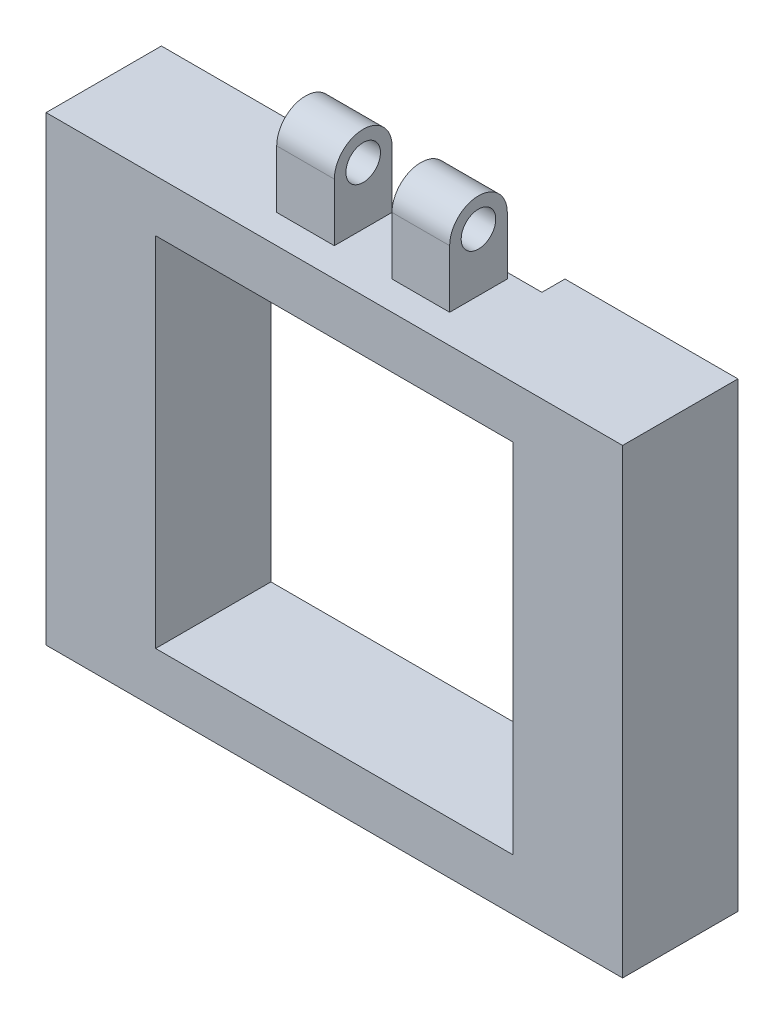
ISO-10303-21;
HEADER;
FILE_DESCRIPTION(('STEP AP214'),'2;1');
FILE_NAME('part.step','',(''),(''),'','','');
FILE_SCHEMA(('AUTOMOTIVE_DESIGN { 1 0 10303 214 1 1 1 1 }'));
ENDSEC;
DATA;
#1=APPLICATION_CONTEXT('core data for automotive mechanical design processes');
#2=APPLICATION_PROTOCOL_DEFINITION('international standard','automotive_design',2000,#1);
#3=PRODUCT_CONTEXT('',#1,'mechanical');
#4=PRODUCT('Part','Part','',(#3));
#5=PRODUCT_RELATED_PRODUCT_CATEGORY('part','',(#4));
#6=PRODUCT_DEFINITION_FORMATION('','',#4);
#7=PRODUCT_DEFINITION_CONTEXT('part definition',#1,'design');
#8=PRODUCT_DEFINITION('design','',#6,#7);
#9=PRODUCT_DEFINITION_SHAPE('','',#8);
#10=(LENGTH_UNIT() NAMED_UNIT(*) SI_UNIT(.MILLI.,.METRE.));
#11=(NAMED_UNIT(*) PLANE_ANGLE_UNIT() SI_UNIT($,.RADIAN.));
#12=(NAMED_UNIT(*) SI_UNIT($,.STERADIAN.) SOLID_ANGLE_UNIT());
#13=UNCERTAINTY_MEASURE_WITH_UNIT(LENGTH_MEASURE(1.E-05),#10,'distance_accuracy_value','');
#14=(GEOMETRIC_REPRESENTATION_CONTEXT(3) GLOBAL_UNCERTAINTY_ASSIGNED_CONTEXT((#13)) GLOBAL_UNIT_ASSIGNED_CONTEXT((#10,
#11,#12)) REPRESENTATION_CONTEXT('',''));
#15=CARTESIAN_POINT('',(0.,0.,0.));
#16=DIRECTION('',(0.,0.,1.));
#17=DIRECTION('',(1.,0.,0.));
#18=AXIS2_PLACEMENT_3D('',#15,#16,#17);
#19=CARTESIAN_POINT('',(-3.96850295792851,467.637931034483,7.5));
#20=DIRECTION('',(0.,0.,-1.));
#21=DIRECTION('',(-1.,0.,0.));
#22=AXIS2_PLACEMENT_3D('',#19,#20,#21);
#23=PLANE('',#22);
#24=DIRECTION('',(1.,0.,0.));
#25=VECTOR('',#24,1.);
#26=CARTESIAN_POINT('',(-13.9685029579222,462.637931034483,7.5));
#27=LINE('',#26,#25);
#28=CARTESIAN_POINT('',(-8.96850295792851,462.637931034483,7.5));
#29=VERTEX_POINT('',#28);
#30=CARTESIAN_POINT('',(-3.96850295792851,462.637931034483,7.5));
#31=VERTEX_POINT('',#30);
#32=EDGE_CURVE('E248',#29,#31,#27,.T.);
#33=ORIENTED_EDGE('',*,*,#32,.F.);
#34=DIRECTION('',(0.,-1.,0.));
#35=VECTOR('',#34,1.);
#36=CARTESIAN_POINT('',(-8.96850295792851,467.637931034483,7.5));
#37=LINE('',#36,#35);
#38=CARTESIAN_POINT('',(-8.96850295792851,457.637931034483,7.5));
#39=VERTEX_POINT('',#38);
#40=EDGE_CURVE('E313',#29,#39,#37,.T.);
#41=ORIENTED_EDGE('',*,*,#40,.T.);
#42=DIRECTION('',(1.,0.,0.));
#43=VECTOR('',#42,1.);
#44=CARTESIAN_POINT('',(-3.96850295792851,457.637931034483,7.5));
#45=LINE('',#44,#43);
#46=CARTESIAN_POINT('',(-3.96850295792851,457.637931034483,7.5));
#47=VERTEX_POINT('',#46);
#48=EDGE_CURVE('E317',#39,#47,#45,.T.);
#49=ORIENTED_EDGE('',*,*,#48,.T.);
#50=DIRECTION('',(0.,1.,0.));
#51=VECTOR('',#50,1.);
#52=CARTESIAN_POINT('',(-3.96850295792851,457.637931034483,7.5));
#53=LINE('',#52,#51);
#54=EDGE_CURVE('E280',#47,#31,#53,.T.);
#55=ORIENTED_EDGE('',*,*,#54,.T.);
#56=EDGE_LOOP('',(#33,#41,#49,#55));
#57=FACE_BOUND('',#56,.T.);
#58=ADVANCED_FACE('F40',(#57),#23,.F.);
#59=CARTESIAN_POINT('',(1.0314970420778,462.637931034483,7.5));
#60=VERTEX_POINT('',#59);
#61=CARTESIAN_POINT('',(6.0314970420778,462.637931034483,7.5));
#62=VERTEX_POINT('',#61);
#63=EDGE_CURVE('E245',#60,#62,#27,.T.);
#64=ORIENTED_EDGE('',*,*,#63,.F.);
#65=DIRECTION('',(0.,1.,0.));
#66=VECTOR('',#65,1.);
#67=CARTESIAN_POINT('',(1.0314970420778,457.637931034483,7.5));
#68=LINE('',#67,#66);
#69=CARTESIAN_POINT('',(1.0314970420778,457.637931034483,7.5));
#70=VERTEX_POINT('',#69);
#71=EDGE_CURVE('E290',#70,#60,#68,.T.);
#72=ORIENTED_EDGE('',*,*,#71,.F.);
#73=CARTESIAN_POINT('',(6.0314970420778,457.637931034483,7.5));
#74=VERTEX_POINT('',#73);
#75=EDGE_CURVE('E316',#70,#74,#45,.T.);
#76=ORIENTED_EDGE('',*,*,#75,.T.);
#77=DIRECTION('',(0.,-1.,0.));
#78=VECTOR('',#77,1.);
#79=CARTESIAN_POINT('',(6.0314970420778,467.637931034483,7.5));
#80=LINE('',#79,#78);
#81=EDGE_CURVE('E300',#62,#74,#80,.T.);
#82=ORIENTED_EDGE('',*,*,#81,.F.);
#83=EDGE_LOOP('',(#64,#72,#76,#82));
#84=FACE_BOUND('',#83,.T.);
#85=ADVANCED_FACE('F443',(#84),#23,.F.);
#86=CARTESIAN_POINT('',(-8.96850295792851,467.637931034483,7.5));
#87=DIRECTION('',(1.,0.,0.));
#88=DIRECTION('',(0.,0.,-1.));
#89=AXIS2_PLACEMENT_3D('',#86,#87,#88);
#90=PLANE('',#89);
#91=CARTESIAN_POINT('',(-8.96850295792851,462.637931034483,5.));
#92=DIRECTION('',(-1.,0.,0.));
#93=DIRECTION('',(0.,0.,1.));
#94=AXIS2_PLACEMENT_3D('',#91,#92,#93);
#95=CIRCLE('',#94,1.5);
#96=CARTESIAN_POINT('',(-8.96850295792851,462.637931034483,6.5));
#97=VERTEX_POINT('',#96);
#98=EDGE_CURVE('E259',#97,#97,#95,.T.);
#99=ORIENTED_EDGE('',*,*,#98,.F.);
#100=EDGE_LOOP('',(#99));
#101=FACE_BOUND('',#100,.T.);
#102=CARTESIAN_POINT('',(-8.96850295792851,462.637931034483,5.));
#103=DIRECTION('',(1.,0.,0.));
#104=DIRECTION('',(0.,0.,-1.));
#105=AXIS2_PLACEMENT_3D('',#102,#103,#104);
#106=CIRCLE('',#105,2.5);
#107=CARTESIAN_POINT('',(-8.96850295792851,462.637931034483,2.5));
#108=VERTEX_POINT('',#107);
#109=EDGE_CURVE('E256',#108,#29,#106,.T.);
#110=ORIENTED_EDGE('',*,*,#109,.F.);
#111=DIRECTION('',(0.,-1.,0.));
#112=VECTOR('',#111,1.);
#113=CARTESIAN_POINT('',(-8.96850295792851,467.637931034483,2.5));
#114=LINE('',#113,#112);
#115=CARTESIAN_POINT('',(-8.96850295792851,457.637931034483,2.5));
#116=VERTEX_POINT('',#115);
#117=EDGE_CURVE('E310',#108,#116,#114,.T.);
#118=ORIENTED_EDGE('',*,*,#117,.T.);
#119=DIRECTION('',(0.,0.,1.));
#120=VECTOR('',#119,1.);
#121=CARTESIAN_POINT('',(-8.96850295792851,457.637931034483,7.5));
#122=LINE('',#121,#120);
#123=EDGE_CURVE('E306',#116,#39,#122,.T.);
#124=ORIENTED_EDGE('',*,*,#123,.T.);
#125=ORIENTED_EDGE('',*,*,#40,.F.);
#126=EDGE_LOOP('',(#110,#118,#124,#125));
#127=FACE_BOUND('',#126,.T.);
#128=ADVANCED_FACE('F428',(#101,#127),#90,.F.);
#129=CARTESIAN_POINT('',(6.0314970420778,467.637931034483,7.5));
#130=DIRECTION('',(-1.,0.,0.));
#131=DIRECTION('',(0.,0.,1.));
#132=AXIS2_PLACEMENT_3D('',#129,#130,#131);
#133=PLANE('',#132);
#134=CARTESIAN_POINT('',(6.0314970420778,462.637931034483,5.));
#135=DIRECTION('',(-1.,0.,0.));
#136=DIRECTION('',(0.,0.,1.));
#137=AXIS2_PLACEMENT_3D('',#134,#135,#136);
#138=CIRCLE('',#137,1.5);
#139=CARTESIAN_POINT('',(6.0314970420778,462.637931034483,6.5));
#140=VERTEX_POINT('',#139);
#141=EDGE_CURVE('E268',#140,#140,#138,.T.);
#142=ORIENTED_EDGE('',*,*,#141,.T.);
#143=EDGE_LOOP('',(#142));
#144=FACE_BOUND('',#143,.T.);
#145=CARTESIAN_POINT('',(6.0314970420778,462.637931034483,5.));
#146=DIRECTION('',(1.,0.,0.));
#147=DIRECTION('',(0.,0.,-1.));
#148=AXIS2_PLACEMENT_3D('',#145,#146,#147);
#149=CIRCLE('',#148,2.5);
#150=CARTESIAN_POINT('',(6.0314970420778,462.637931034483,2.5));
#151=VERTEX_POINT('',#150);
#152=EDGE_CURVE('E232',#151,#62,#149,.T.);
#153=ORIENTED_EDGE('',*,*,#152,.T.);
#154=ORIENTED_EDGE('',*,*,#81,.T.);
#155=DIRECTION('',(0.,0.,-1.));
#156=VECTOR('',#155,1.);
#157=CARTESIAN_POINT('',(6.0314970420778,457.637931034483,7.5));
#158=LINE('',#157,#156);
#159=CARTESIAN_POINT('',(6.0314970420778,457.637931034483,2.5));
#160=VERTEX_POINT('',#159);
#161=EDGE_CURVE('E285',#74,#160,#158,.T.);
#162=ORIENTED_EDGE('',*,*,#161,.T.);
#163=DIRECTION('',(0.,-1.,0.));
#164=VECTOR('',#163,1.);
#165=CARTESIAN_POINT('',(6.0314970420778,467.637931034483,2.5));
#166=LINE('',#165,#164);
#167=EDGE_CURVE('E303',#151,#160,#166,.T.);
#168=ORIENTED_EDGE('',*,*,#167,.F.);
#169=EDGE_LOOP('',(#153,#154,#162,#168));
#170=FACE_BOUND('',#169,.T.);
#171=ADVANCED_FACE('F615',(#144,#170),#133,.F.);
#172=CARTESIAN_POINT('',(-3.96850295792851,467.637931034483,7.5));
#173=DIRECTION('',(-1.,0.,0.));
#174=DIRECTION('',(0.,0.,1.));
#175=AXIS2_PLACEMENT_3D('',#172,#173,#174);
#176=PLANE('',#175);
#177=CARTESIAN_POINT('',(-3.96850295792851,462.637931034483,5.));
#178=DIRECTION('',(-1.,0.,0.));
#179=DIRECTION('',(0.,0.,1.));
#180=AXIS2_PLACEMENT_3D('',#177,#178,#179);
#181=CIRCLE('',#180,1.5);
#182=CARTESIAN_POINT('',(-3.96850295792851,462.637931034483,6.5));
#183=VERTEX_POINT('',#182);
#184=EDGE_CURVE('E264',#183,#183,#181,.T.);
#185=ORIENTED_EDGE('',*,*,#184,.T.);
#186=EDGE_LOOP('',(#185));
#187=FACE_BOUND('',#186,.T.);
#188=CARTESIAN_POINT('',(-3.96850295792851,462.637931034483,5.));
#189=DIRECTION('',(-1.,0.,0.));
#190=DIRECTION('',(0.,0.,1.));
#191=AXIS2_PLACEMENT_3D('',#188,#189,#190);
#192=CIRCLE('',#191,2.5);
#193=CARTESIAN_POINT('',(-3.96850295792851,462.637931034483,2.5));
#194=VERTEX_POINT('',#193);
#195=EDGE_CURVE('E253',#31,#194,#192,.T.);
#196=ORIENTED_EDGE('',*,*,#195,.F.);
#197=ORIENTED_EDGE('',*,*,#54,.F.);
#198=DIRECTION('',(0.,0.,1.));
#199=VECTOR('',#198,1.);
#200=CARTESIAN_POINT('',(-3.96850295792851,457.637931034483,2.5));
#201=LINE('',#200,#199);
#202=CARTESIAN_POINT('',(-3.96850295792851,457.637931034483,2.5));
#203=VERTEX_POINT('',#202);
#204=EDGE_CURVE('E272',#203,#47,#201,.T.);
#205=ORIENTED_EDGE('',*,*,#204,.F.);
#206=DIRECTION('',(0.,1.,0.));
#207=VECTOR('',#206,1.);
#208=CARTESIAN_POINT('',(-3.96850295792851,457.637931034483,2.5));
#209=LINE('',#208,#207);
#210=EDGE_CURVE('E281',#203,#194,#209,.T.);
#211=ORIENTED_EDGE('',*,*,#210,.T.);
#212=EDGE_LOOP('',(#196,#197,#205,#211));
#213=FACE_BOUND('',#212,.T.);
#214=ADVANCED_FACE('F420',(#187,#213),#176,.F.);
#215=CARTESIAN_POINT('',(1.0314970420778,467.637931034483,7.5));
#216=DIRECTION('',(1.,0.,0.));
#217=DIRECTION('',(0.,0.,-1.));
#218=AXIS2_PLACEMENT_3D('',#215,#216,#217);
#219=PLANE('',#218);
#220=CARTESIAN_POINT('',(1.0314970420778,462.637931034483,5.));
#221=DIRECTION('',(1.,0.,0.));
#222=DIRECTION('',(0.,0.,-1.));
#223=AXIS2_PLACEMENT_3D('',#220,#221,#222);
#224=CIRCLE('',#223,1.5);
#225=CARTESIAN_POINT('',(1.0314970420778,462.637931034483,3.5));
#226=VERTEX_POINT('',#225);
#227=EDGE_CURVE('E263',#226,#226,#224,.T.);
#228=ORIENTED_EDGE('',*,*,#227,.T.);
#229=EDGE_LOOP('',(#228));
#230=FACE_BOUND('',#229,.T.);
#231=CARTESIAN_POINT('',(1.0314970420778,462.637931034483,5.));
#232=DIRECTION('',(1.,0.,0.));
#233=DIRECTION('',(0.,0.,-1.));
#234=AXIS2_PLACEMENT_3D('',#231,#232,#233);
#235=CIRCLE('',#234,2.5);
#236=CARTESIAN_POINT('',(1.03149704207149,462.637931034483,2.5));
#237=VERTEX_POINT('',#236);
#238=EDGE_CURVE('E369',#237,#60,#235,.T.);
#239=ORIENTED_EDGE('',*,*,#238,.F.);
#240=DIRECTION('',(0.,1.,0.));
#241=VECTOR('',#240,1.);
#242=CARTESIAN_POINT('',(1.03149704207149,457.637931034483,2.5));
#243=LINE('',#242,#241);
#244=CARTESIAN_POINT('',(1.03149704207149,457.637931034483,2.5));
#245=VERTEX_POINT('',#244);
#246=EDGE_CURVE('E286',#245,#237,#243,.T.);
#247=ORIENTED_EDGE('',*,*,#246,.F.);
#248=DIRECTION('',(-1.26114396703514E-12,0.,-1.));
#249=VECTOR('',#248,1.);
#250=CARTESIAN_POINT('',(1.03149704207149,457.637931034483,2.5));
#251=LINE('',#250,#249);
#252=EDGE_CURVE('E276',#70,#245,#251,.T.);
#253=ORIENTED_EDGE('',*,*,#252,.F.);
#254=ORIENTED_EDGE('',*,*,#71,.T.);
#255=EDGE_LOOP('',(#239,#247,#253,#254));
#256=FACE_BOUND('',#255,.T.);
#257=ADVANCED_FACE('F595',(#230,#256),#219,.F.);
#258=CARTESIAN_POINT('',(-3.96850295792851,467.637931034483,2.5));
#259=DIRECTION('',(0.,0.,1.));
#260=DIRECTION('',(1.,0.,0.));
#261=AXIS2_PLACEMENT_3D('',#258,#259,#260);
#262=PLANE('',#261);
#263=ORIENTED_EDGE('',*,*,#117,.F.);
#264=DIRECTION('',(1.,0.,0.));
#265=VECTOR('',#264,1.);
#266=CARTESIAN_POINT('',(-13.9685029579222,462.637931034483,2.5));
#267=LINE('',#266,#265);
#268=EDGE_CURVE('E249',#108,#194,#267,.T.);
#269=ORIENTED_EDGE('',*,*,#268,.T.);
#270=ORIENTED_EDGE('',*,*,#210,.F.);
#271=DIRECTION('',(-1.,0.,0.));
#272=VECTOR('',#271,1.);
#273=CARTESIAN_POINT('',(-3.96850295792851,457.637931034483,2.5));
#274=LINE('',#273,#272);
#275=EDGE_CURVE('E321',#203,#116,#274,.T.);
#276=ORIENTED_EDGE('',*,*,#275,.T.);
#277=EDGE_LOOP('',(#263,#269,#270,#276));
#278=FACE_BOUND('',#277,.T.);
#279=ADVANCED_FACE('F414',(#278),#262,.F.);
#280=CARTESIAN_POINT('',(-26.4685029579254,457.637931034483,10.));
#281=DIRECTION('',(0.,-1.,0.));
#282=DIRECTION('',(0.,0.,-1.));
#283=AXIS2_PLACEMENT_3D('',#280,#281,#282);
#284=PLANE('',#283);
#285=DIRECTION('',(-1.,0.,0.));
#286=VECTOR('',#285,1.);
#287=CARTESIAN_POINT('',(-26.4685029579254,457.637931034483,0.));
#288=LINE('',#287,#286);
#289=CARTESIAN_POINT('',(23.5314970420778,457.637931034483,0.));
#290=VERTEX_POINT('',#289);
#291=CARTESIAN_POINT('',(8.53149704207464,457.637931034483,0.));
#292=VERTEX_POINT('',#291);
#293=EDGE_CURVE('E347',#290,#292,#288,.T.);
#294=ORIENTED_EDGE('',*,*,#293,.T.);
#295=DIRECTION('',(0.,0.,-1.));
#296=VECTOR('',#295,1.);
#297=CARTESIAN_POINT('',(8.53149704207464,457.637931034483,2.));
#298=LINE('',#297,#296);
#299=CARTESIAN_POINT('',(8.53149704207464,457.637931034483,2.));
#300=VERTEX_POINT('',#299);
#301=EDGE_CURVE('E197',#300,#292,#298,.T.);
#302=ORIENTED_EDGE('',*,*,#301,.F.);
#303=DIRECTION('',(1.,0.,0.));
#304=VECTOR('',#303,1.);
#305=CARTESIAN_POINT('',(8.53149704207464,457.637931034483,2.));
#306=LINE('',#305,#304);
#307=CARTESIAN_POINT('',(-11.4685029579254,457.637931034483,2.));
#308=VERTEX_POINT('',#307);
#309=EDGE_CURVE('E181',#308,#300,#306,.T.);
#310=ORIENTED_EDGE('',*,*,#309,.F.);
#311=DIRECTION('',(0.,0.,-1.));
#312=VECTOR('',#311,1.);
#313=CARTESIAN_POINT('',(-11.4685029579254,457.637931034483,2.));
#314=LINE('',#313,#312);
#315=CARTESIAN_POINT('',(-11.4685029579254,457.637931034483,0.));
#316=VERTEX_POINT('',#315);
#317=EDGE_CURVE('E190',#308,#316,#314,.T.);
#318=ORIENTED_EDGE('',*,*,#317,.T.);
#319=CARTESIAN_POINT('',(-26.4685029579285,457.637931034483,0.));
#320=VERTEX_POINT('',#319);
#321=EDGE_CURVE('E359',#316,#320,#288,.T.);
#322=ORIENTED_EDGE('',*,*,#321,.T.);
#323=DIRECTION('',(0.,0.,-1.));
#324=VECTOR('',#323,1.);
#325=CARTESIAN_POINT('',(-26.4685029579285,457.637931034483,10.));
#326=LINE('',#325,#324);
#327=CARTESIAN_POINT('',(-26.4685029579285,457.637931034483,10.));
#328=VERTEX_POINT('',#327);
#329=EDGE_CURVE('E338',#328,#320,#326,.T.);
#330=ORIENTED_EDGE('',*,*,#329,.F.);
#331=DIRECTION('',(-1.,0.,0.));
#332=VECTOR('',#331,1.);
#333=CARTESIAN_POINT('',(-26.4685029579254,457.637931034483,10.));
#334=LINE('',#333,#332);
#335=CARTESIAN_POINT('',(23.5314970420778,457.637931034483,10.));
#336=VERTEX_POINT('',#335);
#337=EDGE_CURVE('E350',#336,#328,#334,.T.);
#338=ORIENTED_EDGE('',*,*,#337,.F.);
#339=DIRECTION('',(0.,0.,-1.));
#340=VECTOR('',#339,1.);
#341=CARTESIAN_POINT('',(23.5314970420778,457.637931034483,10.));
#342=LINE('',#341,#340);
#343=EDGE_CURVE('E353',#336,#290,#342,.T.);
#344=ORIENTED_EDGE('',*,*,#343,.T.);
#345=EDGE_LOOP('',(#294,#302,#310,#318,#322,#330,#338,#344));
#346=FACE_BOUND('',#345,.T.);
#347=ORIENTED_EDGE('',*,*,#75,.F.);
#348=ORIENTED_EDGE('',*,*,#252,.T.);
#349=EDGE_CURVE('E322',#160,#245,#274,.T.);
#350=ORIENTED_EDGE('',*,*,#349,.F.);
#351=ORIENTED_EDGE('',*,*,#161,.F.);
#352=EDGE_LOOP('',(#347,#348,#350,#351));
#353=FACE_BOUND('',#352,.T.);
#354=ORIENTED_EDGE('',*,*,#204,.T.);
#355=ORIENTED_EDGE('',*,*,#48,.F.);
#356=ORIENTED_EDGE('',*,*,#123,.F.);
#357=ORIENTED_EDGE('',*,*,#275,.F.);
#358=EDGE_LOOP('',(#354,#355,#356,#357));
#359=FACE_BOUND('',#358,.T.);
#360=ADVANCED_FACE('F201',(#346,#353,#359),#284,.F.);
#361=CARTESIAN_POINT('',(23.5314970420778,457.637931034483,10.));
#362=DIRECTION('',(-1.,0.,0.));
#363=DIRECTION('',(0.,-1.,0.));
#364=AXIS2_PLACEMENT_3D('',#361,#362,#363);
#365=PLANE('',#364);
#366=DIRECTION('',(0.,1.,0.));
#367=VECTOR('',#366,1.);
#368=CARTESIAN_POINT('',(23.5314970420778,457.637931034483,0.));
#369=LINE('',#368,#367);
#370=CARTESIAN_POINT('',(23.5314970420747,417.637931034484,0.));
#371=VERTEX_POINT('',#370);
#372=EDGE_CURVE('E356',#371,#290,#369,.T.);
#373=ORIENTED_EDGE('',*,*,#372,.T.);
#374=ORIENTED_EDGE('',*,*,#343,.F.);
#375=DIRECTION('',(0.,1.,0.));
#376=VECTOR('',#375,1.);
#377=CARTESIAN_POINT('',(23.5314970420778,457.637931034483,10.));
#378=LINE('',#377,#376);
#379=CARTESIAN_POINT('',(23.5314970420747,417.637931034484,10.));
#380=VERTEX_POINT('',#379);
#381=EDGE_CURVE('E346',#380,#336,#378,.T.);
#382=ORIENTED_EDGE('',*,*,#381,.F.);
#383=DIRECTION('',(0.,0.,-1.));
#384=VECTOR('',#383,1.);
#385=CARTESIAN_POINT('',(23.5314970420747,417.637931034484,10.));
#386=LINE('',#385,#384);
#387=EDGE_CURVE('E365',#380,#371,#386,.T.);
#388=ORIENTED_EDGE('',*,*,#387,.T.);
#389=EDGE_LOOP('',(#373,#374,#382,#388));
#390=FACE_BOUND('',#389,.T.);
#391=ADVANCED_FACE('F464',(#390),#365,.F.);
#392=CARTESIAN_POINT('',(-26.4685029579254,417.637931034484,10.));
#393=DIRECTION('',(0.,1.,0.));
#394=DIRECTION('',(0.,0.,1.));
#395=AXIS2_PLACEMENT_3D('',#392,#393,#394);
#396=PLANE('',#395);
#397=DIRECTION('',(1.,0.,0.));
#398=VECTOR('',#397,1.);
#399=CARTESIAN_POINT('',(-26.4685029579254,417.637931034484,10.));
#400=LINE('',#399,#398);
#401=CARTESIAN_POINT('',(-26.4685029579254,417.637931034484,10.));
#402=VERTEX_POINT('',#401);
#403=EDGE_CURVE('E343',#402,#380,#400,.T.);
#404=ORIENTED_EDGE('',*,*,#403,.F.);
#405=DIRECTION('',(0.,0.,-1.));
#406=VECTOR('',#405,1.);
#407=CARTESIAN_POINT('',(-26.4685029579254,417.637931034484,10.));
#408=LINE('',#407,#406);
#409=CARTESIAN_POINT('',(-26.4685029579254,417.637931034484,0.));
#410=VERTEX_POINT('',#409);
#411=EDGE_CURVE('E331',#402,#410,#408,.T.);
#412=ORIENTED_EDGE('',*,*,#411,.T.);
#413=DIRECTION('',(1.,0.,0.));
#414=VECTOR('',#413,1.);
#415=CARTESIAN_POINT('',(-26.4685029579254,417.637931034484,0.));
#416=LINE('',#415,#414);
#417=EDGE_CURVE('E342',#410,#371,#416,.T.);
#418=ORIENTED_EDGE('',*,*,#417,.T.);
#419=ORIENTED_EDGE('',*,*,#387,.F.);
#420=EDGE_LOOP('',(#404,#412,#418,#419));
#421=FACE_BOUND('',#420,.T.);
#422=ADVANCED_FACE('F42',(#421),#396,.F.);
#423=CARTESIAN_POINT('',(0.,0.,10.));
#424=DIRECTION('',(0.,0.,1.));
#425=DIRECTION('',(1.,0.,0.));
#426=AXIS2_PLACEMENT_3D('',#423,#424,#425);
#427=PLANE('',#426);
#428=DIRECTION('',(0.,-1.,0.));
#429=VECTOR('',#428,1.);
#430=CARTESIAN_POINT('',(-16.9685029579254,453.137931034484,10.));
#431=LINE('',#430,#429);
#432=CARTESIAN_POINT('',(-16.9685029579254,453.137931034484,10.));
#433=VERTEX_POINT('',#432);
#434=CARTESIAN_POINT('',(-16.9685029579254,422.137931034484,10.));
#435=VERTEX_POINT('',#434);
#436=EDGE_CURVE('E64',#433,#435,#431,.T.);
#437=ORIENTED_EDGE('',*,*,#436,.F.);
#438=DIRECTION('',(-1.,0.,0.));
#439=VECTOR('',#438,1.);
#440=CARTESIAN_POINT('',(-16.9685029579254,453.137931034484,10.));
#441=LINE('',#440,#439);
#442=CARTESIAN_POINT('',(14.0314970420746,453.137931034484,10.));
#443=VERTEX_POINT('',#442);
#444=EDGE_CURVE('E224',#443,#433,#441,.T.);
#445=ORIENTED_EDGE('',*,*,#444,.F.);
#446=DIRECTION('',(0.,1.,0.));
#447=VECTOR('',#446,1.);
#448=CARTESIAN_POINT('',(14.0314970420746,453.137931034484,10.));
#449=LINE('',#448,#447);
#450=CARTESIAN_POINT('',(14.0314970420746,422.137931034484,10.));
#451=VERTEX_POINT('',#450);
#452=EDGE_CURVE('E220',#451,#443,#449,.T.);
#453=ORIENTED_EDGE('',*,*,#452,.F.);
#454=DIRECTION('',(1.,0.,0.));
#455=VECTOR('',#454,1.);
#456=CARTESIAN_POINT('',(-16.9685029579254,422.137931034484,10.));
#457=LINE('',#456,#455);
#458=EDGE_CURVE('E216',#435,#451,#457,.T.);
#459=ORIENTED_EDGE('',*,*,#458,.F.);
#460=EDGE_LOOP('',(#437,#445,#453,#459));
#461=FACE_BOUND('',#460,.T.);
#462=ORIENTED_EDGE('',*,*,#337,.T.);
#463=DIRECTION('',(0.,1.,0.));
#464=VECTOR('',#463,1.);
#465=CARTESIAN_POINT('',(-26.4685029579285,457.637931034483,10.));
#466=LINE('',#465,#464);
#467=EDGE_CURVE('E327',#402,#328,#466,.T.);
#468=ORIENTED_EDGE('',*,*,#467,.F.);
#469=ORIENTED_EDGE('',*,*,#403,.T.);
#470=ORIENTED_EDGE('',*,*,#381,.T.);
#471=EDGE_LOOP('',(#462,#468,#469,#470));
#472=FACE_BOUND('',#471,.T.);
#473=ADVANCED_FACE('F457',(#461,#472),#427,.T.);
#474=CARTESIAN_POINT('',(0.,0.,0.));
#475=DIRECTION('',(0.,0.,1.));
#476=DIRECTION('',(1.,0.,0.));
#477=AXIS2_PLACEMENT_3D('',#474,#475,#476);
#478=PLANE('',#477);
#479=DIRECTION('',(-1.,0.,0.));
#480=VECTOR('',#479,1.);
#481=CARTESIAN_POINT('',(8.11426071557242E-13,453.137931034484,0.));
#482=LINE('',#481,#480);
#483=CARTESIAN_POINT('',(14.0314970420746,453.137931034484,0.));
#484=VERTEX_POINT('',#483);
#485=CARTESIAN_POINT('',(8.53149704207464,453.137931034484,0.));
#486=VERTEX_POINT('',#485);
#487=EDGE_CURVE('E384',#484,#486,#482,.T.);
#488=ORIENTED_EDGE('',*,*,#487,.T.);
#489=DIRECTION('',(0.,-1.,0.));
#490=VECTOR('',#489,1.);
#491=CARTESIAN_POINT('',(8.53149704207464,452.638733889842,0.));
#492=LINE('',#491,#490);
#493=EDGE_CURVE('E187',#292,#486,#492,.T.);
#494=ORIENTED_EDGE('',*,*,#493,.F.);
#495=ORIENTED_EDGE('',*,*,#293,.F.);
#496=ORIENTED_EDGE('',*,*,#372,.F.);
#497=ORIENTED_EDGE('',*,*,#417,.F.);
#498=DIRECTION('',(0.,1.,0.));
#499=VECTOR('',#498,1.);
#500=CARTESIAN_POINT('',(-26.4685029579285,457.637931034483,0.));
#501=LINE('',#500,#499);
#502=EDGE_CURVE('E326',#410,#320,#501,.T.);
#503=ORIENTED_EDGE('',*,*,#502,.T.);
#504=ORIENTED_EDGE('',*,*,#321,.F.);
#505=DIRECTION('',(0.,1.,0.));
#506=VECTOR('',#505,1.);
#507=CARTESIAN_POINT('',(-11.4685029579254,452.638733889842,0.));
#508=LINE('',#507,#506);
#509=CARTESIAN_POINT('',(-11.4685029579254,453.137931034484,0.));
#510=VERTEX_POINT('',#509);
#511=EDGE_CURVE('E193',#510,#316,#508,.T.);
#512=ORIENTED_EDGE('',*,*,#511,.F.);
#513=CARTESIAN_POINT('',(-16.9685029579254,453.137931034484,0.));
#514=VERTEX_POINT('',#513);
#515=EDGE_CURVE('E383',#510,#514,#482,.T.);
#516=ORIENTED_EDGE('',*,*,#515,.T.);
#517=DIRECTION('',(0.,-1.,0.));
#518=VECTOR('',#517,1.);
#519=CARTESIAN_POINT('',(-16.9685029579254,0.,0.));
#520=LINE('',#519,#518);
#521=CARTESIAN_POINT('',(-16.9685029579254,422.137931034484,0.));
#522=VERTEX_POINT('',#521);
#523=EDGE_CURVE('E388',#514,#522,#520,.T.);
#524=ORIENTED_EDGE('',*,*,#523,.T.);
#525=DIRECTION('',(1.,0.,0.));
#526=VECTOR('',#525,1.);
#527=CARTESIAN_POINT('',(0.,422.137931034484,0.));
#528=LINE('',#527,#526);
#529=CARTESIAN_POINT('',(14.0314970420746,422.137931034484,0.));
#530=VERTEX_POINT('',#529);
#531=EDGE_CURVE('E375',#522,#530,#528,.T.);
#532=ORIENTED_EDGE('',*,*,#531,.T.);
#533=DIRECTION('',(0.,1.,0.));
#534=VECTOR('',#533,1.);
#535=CARTESIAN_POINT('',(14.0314970420746,0.,0.));
#536=LINE('',#535,#534);
#537=EDGE_CURVE('E379',#530,#484,#536,.T.);
#538=ORIENTED_EDGE('',*,*,#537,.T.);
#539=EDGE_LOOP('',(#488,#494,#495,#496,#497,#503,#504,#512,#516,#524,#532,#538));
#540=FACE_BOUND('',#539,.T.);
#541=ADVANCED_FACE('F399',(#540),#478,.F.);
#542=CARTESIAN_POINT('',(-26.4685029579285,457.637931034483,10.));
#543=DIRECTION('',(-1.,0.,0.));
#544=DIRECTION('',(0.,-1.,0.));
#545=AXIS2_PLACEMENT_3D('',#542,#543,#544);
#546=PLANE('',#545);
#547=ORIENTED_EDGE('',*,*,#502,.F.);
#548=ORIENTED_EDGE('',*,*,#411,.F.);
#549=ORIENTED_EDGE('',*,*,#467,.T.);
#550=ORIENTED_EDGE('',*,*,#329,.T.);
#551=EDGE_LOOP('',(#547,#548,#549,#550));
#552=FACE_BOUND('',#551,.T.);
#553=ADVANCED_FACE('F453',(#552),#546,.T.);
#554=ORIENTED_EDGE('',*,*,#246,.T.);
#555=EDGE_CURVE('E244',#237,#151,#267,.T.);
#556=ORIENTED_EDGE('',*,*,#555,.T.);
#557=ORIENTED_EDGE('',*,*,#167,.T.);
#558=ORIENTED_EDGE('',*,*,#349,.T.);
#559=EDGE_LOOP('',(#554,#556,#557,#558));
#560=FACE_BOUND('',#559,.T.);
#561=ADVANCED_FACE('F451',(#560),#262,.F.);
#562=CARTESIAN_POINT('',(34.0314970420715,462.637931034483,5.));
#563=DIRECTION('',(-1.,0.,0.));
#564=DIRECTION('',(0.,0.,1.));
#565=AXIS2_PLACEMENT_3D('',#562,#563,#564);
#566=CYLINDRICAL_SURFACE('',#565,1.5);
#567=ORIENTED_EDGE('',*,*,#227,.F.);
#568=EDGE_LOOP('',(#567));
#569=FACE_BOUND('',#568,.T.);
#570=ORIENTED_EDGE('',*,*,#141,.F.);
#571=EDGE_LOOP('',(#570));
#572=FACE_BOUND('',#571,.T.);
#573=ADVANCED_FACE('F585',(#569,#572),#566,.F.);
#574=ORIENTED_EDGE('',*,*,#98,.T.);
#575=EDGE_LOOP('',(#574));
#576=FACE_BOUND('',#575,.T.);
#577=ORIENTED_EDGE('',*,*,#184,.F.);
#578=EDGE_LOOP('',(#577));
#579=FACE_BOUND('',#578,.T.);
#580=ADVANCED_FACE('F439',(#576,#579),#566,.F.);
#581=CARTESIAN_POINT('',(-13.9685029579222,462.637931034483,5.));
#582=DIRECTION('',(1.,0.,0.));
#583=DIRECTION('',(0.,0.,-1.));
#584=AXIS2_PLACEMENT_3D('',#581,#582,#583);
#585=CYLINDRICAL_SURFACE('',#584,2.5);
#586=ORIENTED_EDGE('',*,*,#238,.T.);
#587=ORIENTED_EDGE('',*,*,#63,.T.);
#588=ORIENTED_EDGE('',*,*,#152,.F.);
#589=ORIENTED_EDGE('',*,*,#555,.F.);
#590=EDGE_LOOP('',(#586,#587,#588,#589));
#591=FACE_BOUND('',#590,.T.);
#592=ADVANCED_FACE('F432',(#591),#585,.T.);
#593=ORIENTED_EDGE('',*,*,#109,.T.);
#594=ORIENTED_EDGE('',*,*,#32,.T.);
#595=ORIENTED_EDGE('',*,*,#195,.T.);
#596=ORIENTED_EDGE('',*,*,#268,.F.);
#597=EDGE_LOOP('',(#593,#594,#595,#596));
#598=FACE_BOUND('',#597,.T.);
#599=ADVANCED_FACE('F429',(#598),#585,.T.);
#600=CARTESIAN_POINT('',(-16.9685029579254,453.137931034484,-20.));
#601=DIRECTION('',(-1.,0.,0.));
#602=DIRECTION('',(0.,0.,1.));
#603=AXIS2_PLACEMENT_3D('',#600,#601,#602);
#604=PLANE('',#603);
#605=DIRECTION('',(0.,0.,1.));
#606=VECTOR('',#605,1.);
#607=CARTESIAN_POINT('',(-16.9685029579254,453.137931034484,-20.));
#608=LINE('',#607,#606);
#609=EDGE_CURVE('E229',#514,#433,#608,.T.);
#610=ORIENTED_EDGE('',*,*,#609,.T.);
#611=ORIENTED_EDGE('',*,*,#436,.T.);
#612=DIRECTION('',(0.,0.,1.));
#613=VECTOR('',#612,1.);
#614=CARTESIAN_POINT('',(-16.9685029579254,422.137931034484,-20.));
#615=LINE('',#614,#613);
#616=EDGE_CURVE('E228',#522,#435,#615,.T.);
#617=ORIENTED_EDGE('',*,*,#616,.F.);
#618=ORIENTED_EDGE('',*,*,#523,.F.);
#619=EDGE_LOOP('',(#610,#611,#617,#618));
#620=FACE_BOUND('',#619,.T.);
#621=ADVANCED_FACE('F431',(#620),#604,.F.);
#622=CARTESIAN_POINT('',(-16.9685029579254,453.137931034484,-20.));
#623=DIRECTION('',(0.,1.,0.));
#624=DIRECTION('',(-1.,0.,0.));
#625=AXIS2_PLACEMENT_3D('',#622,#623,#624);
#626=PLANE('',#625);
#627=DIRECTION('',(-1.,0.,0.));
#628=VECTOR('',#627,1.);
#629=CARTESIAN_POINT('',(-16.9685029579254,453.137931034484,2.));
#630=LINE('',#629,#628);
#631=CARTESIAN_POINT('',(8.53149704207464,453.137931034484,2.));
#632=VERTEX_POINT('',#631);
#633=CARTESIAN_POINT('',(-11.4685029579254,453.137931034484,2.));
#634=VERTEX_POINT('',#633);
#635=EDGE_CURVE('E183',#632,#634,#630,.T.);
#636=ORIENTED_EDGE('',*,*,#635,.F.);
#637=DIRECTION('',(0.,0.,-1.));
#638=VECTOR('',#637,1.);
#639=CARTESIAN_POINT('',(8.53149704207464,453.137931034484,-20.));
#640=LINE('',#639,#638);
#641=EDGE_CURVE('E11',#632,#486,#640,.T.);
#642=ORIENTED_EDGE('',*,*,#641,.T.);
#643=ORIENTED_EDGE('',*,*,#487,.F.);
#644=DIRECTION('',(0.,0.,1.));
#645=VECTOR('',#644,1.);
#646=CARTESIAN_POINT('',(14.0314970420746,453.137931034484,-20.));
#647=LINE('',#646,#645);
#648=EDGE_CURVE('E233',#484,#443,#647,.T.);
#649=ORIENTED_EDGE('',*,*,#648,.T.);
#650=ORIENTED_EDGE('',*,*,#444,.T.);
#651=ORIENTED_EDGE('',*,*,#609,.F.);
#652=ORIENTED_EDGE('',*,*,#515,.F.);
#653=DIRECTION('',(0.,0.,1.));
#654=VECTOR('',#653,1.);
#655=CARTESIAN_POINT('',(-11.4685029579254,453.137931034484,-20.));
#656=LINE('',#655,#654);
#657=EDGE_CURVE('E49',#510,#634,#656,.T.);
#658=ORIENTED_EDGE('',*,*,#657,.T.);
#659=EDGE_LOOP('',(#636,#642,#643,#649,#650,#651,#652,#658));
#660=FACE_BOUND('',#659,.T.);
#661=ADVANCED_FACE('F396',(#660),#626,.F.);
#662=CARTESIAN_POINT('',(14.0314970420746,453.137931034484,-20.));
#663=DIRECTION('',(1.,0.,0.));
#664=DIRECTION('',(0.,0.,-1.));
#665=AXIS2_PLACEMENT_3D('',#662,#663,#664);
#666=PLANE('',#665);
#667=DIRECTION('',(0.,0.,1.));
#668=VECTOR('',#667,1.);
#669=CARTESIAN_POINT('',(14.0314970420746,422.137931034484,-20.));
#670=LINE('',#669,#668);
#671=EDGE_CURVE('E236',#530,#451,#670,.T.);
#672=ORIENTED_EDGE('',*,*,#671,.T.);
#673=ORIENTED_EDGE('',*,*,#452,.T.);
#674=ORIENTED_EDGE('',*,*,#648,.F.);
#675=ORIENTED_EDGE('',*,*,#537,.F.);
#676=EDGE_LOOP('',(#672,#673,#674,#675));
#677=FACE_BOUND('',#676,.T.);
#678=ADVANCED_FACE('F483',(#677),#666,.F.);
#679=CARTESIAN_POINT('',(-16.9685029579254,422.137931034484,-20.));
#680=DIRECTION('',(0.,-1.,0.));
#681=DIRECTION('',(0.,0.,-1.));
#682=AXIS2_PLACEMENT_3D('',#679,#680,#681);
#683=PLANE('',#682);
#684=ORIENTED_EDGE('',*,*,#616,.T.);
#685=ORIENTED_EDGE('',*,*,#458,.T.);
#686=ORIENTED_EDGE('',*,*,#671,.F.);
#687=ORIENTED_EDGE('',*,*,#531,.F.);
#688=EDGE_LOOP('',(#684,#685,#686,#687));
#689=FACE_BOUND('',#688,.T.);
#690=ADVANCED_FACE('F487',(#689),#683,.F.);
#691=CARTESIAN_POINT('',(8.53149704207464,452.638733889842,2.));
#692=DIRECTION('',(1.,0.,0.));
#693=DIRECTION('',(0.,0.,-1.));
#694=AXIS2_PLACEMENT_3D('',#691,#692,#693);
#695=PLANE('',#694);
#696=DIRECTION('',(0.,-1.,0.));
#697=VECTOR('',#696,1.);
#698=CARTESIAN_POINT('',(8.53149704207464,452.638733889842,2.));
#699=LINE('',#698,#697);
#700=EDGE_CURVE('E56',#300,#632,#699,.T.);
#701=ORIENTED_EDGE('',*,*,#700,.F.);
#702=ORIENTED_EDGE('',*,*,#301,.T.);
#703=ORIENTED_EDGE('',*,*,#493,.T.);
#704=ORIENTED_EDGE('',*,*,#641,.F.);
#705=EDGE_LOOP('',(#701,#702,#703,#704));
#706=FACE_BOUND('',#705,.T.);
#707=ADVANCED_FACE('F479',(#706),#695,.F.);
#708=CARTESIAN_POINT('',(-11.4685029579254,452.638733889842,2.));
#709=DIRECTION('',(-1.,0.,0.));
#710=DIRECTION('',(0.,0.,1.));
#711=AXIS2_PLACEMENT_3D('',#708,#709,#710);
#712=PLANE('',#711);
#713=ORIENTED_EDGE('',*,*,#511,.T.);
#714=ORIENTED_EDGE('',*,*,#317,.F.);
#715=DIRECTION('',(0.,1.,0.));
#716=VECTOR('',#715,1.);
#717=CARTESIAN_POINT('',(-11.4685029579254,452.638733889842,2.));
#718=LINE('',#717,#716);
#719=EDGE_CURVE('E177',#634,#308,#718,.T.);
#720=ORIENTED_EDGE('',*,*,#719,.F.);
#721=ORIENTED_EDGE('',*,*,#657,.F.);
#722=EDGE_LOOP('',(#713,#714,#720,#721));
#723=FACE_BOUND('',#722,.T.);
#724=ADVANCED_FACE('F191',(#723),#712,.F.);
#725=CARTESIAN_POINT('',(0.,0.,2.));
#726=DIRECTION('',(0.,0.,-1.));
#727=DIRECTION('',(-1.,0.,0.));
#728=AXIS2_PLACEMENT_3D('',#725,#726,#727);
#729=PLANE('',#728);
#730=ORIENTED_EDGE('',*,*,#635,.T.);
#731=ORIENTED_EDGE('',*,*,#719,.T.);
#732=ORIENTED_EDGE('',*,*,#309,.T.);
#733=ORIENTED_EDGE('',*,*,#700,.T.);
#734=EDGE_LOOP('',(#730,#731,#732,#733));
#735=FACE_BOUND('',#734,.T.);
#736=ADVANCED_FACE('F179',(#735),#729,.T.);
#737=CLOSED_SHELL('',(#58,#85,#128,#171,#214,#257,#279,#360,#391,#422,#473,#541,#553,#561,#573,
#580,#592,#599,#621,#661,#678,#690,#707,#724,#736));
#738=MANIFOLD_SOLID_BREP('B2',#737);
#739=ADVANCED_BREP_SHAPE_REPRESENTATION('',(#18,#738),#14);
#740=SHAPE_DEFINITION_REPRESENTATION(#9,#739);
ENDSEC;
END-ISO-10303-21;
